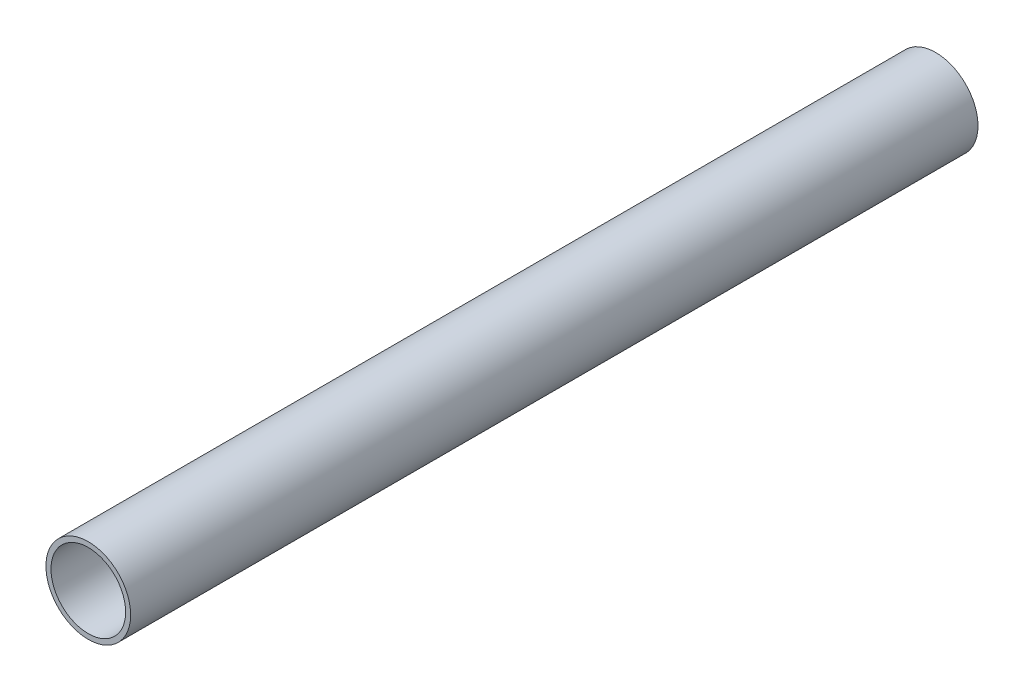
ISO-10303-21;
HEADER;
FILE_DESCRIPTION(('STEP AP214'),'2;1');
FILE_NAME('part.step','',(''),(''),'','','');
FILE_SCHEMA(('AUTOMOTIVE_DESIGN { 1 0 10303 214 1 1 1 1 }'));
ENDSEC;
DATA;
#1=APPLICATION_CONTEXT('core data for automotive mechanical design processes');
#2=APPLICATION_PROTOCOL_DEFINITION('international standard','automotive_design',2000,#1);
#3=PRODUCT_CONTEXT('',#1,'mechanical');
#4=PRODUCT('Part','Part','',(#3));
#5=PRODUCT_RELATED_PRODUCT_CATEGORY('part','',(#4));
#6=PRODUCT_DEFINITION_FORMATION('','',#4);
#7=PRODUCT_DEFINITION_CONTEXT('part definition',#1,'design');
#8=PRODUCT_DEFINITION('design','',#6,#7);
#9=PRODUCT_DEFINITION_SHAPE('','',#8);
#10=(LENGTH_UNIT() NAMED_UNIT(*) SI_UNIT(.MILLI.,.METRE.));
#11=(NAMED_UNIT(*) PLANE_ANGLE_UNIT() SI_UNIT($,.RADIAN.));
#12=(NAMED_UNIT(*) SI_UNIT($,.STERADIAN.) SOLID_ANGLE_UNIT());
#13=UNCERTAINTY_MEASURE_WITH_UNIT(LENGTH_MEASURE(1.E-05),#10,'distance_accuracy_value','');
#14=(GEOMETRIC_REPRESENTATION_CONTEXT(3) GLOBAL_UNCERTAINTY_ASSIGNED_CONTEXT((#13)) GLOBAL_UNIT_ASSIGNED_CONTEXT((#10,
#11,#12)) REPRESENTATION_CONTEXT('',''));
#15=CARTESIAN_POINT('',(0.,0.,0.));
#16=DIRECTION('',(0.,0.,1.));
#17=DIRECTION('',(1.,0.,0.));
#18=AXIS2_PLACEMENT_3D('',#15,#16,#17);
#19=CARTESIAN_POINT('',(0.,0.,320.));
#20=DIRECTION('',(0.,0.,1.));
#21=DIRECTION('',(1.,0.,0.));
#22=AXIS2_PLACEMENT_3D('',#19,#20,#21);
#23=PLANE('',#22);
#24=CARTESIAN_POINT('',(0.,0.,320.));
#25=DIRECTION('',(0.,0.,1.));
#26=DIRECTION('',(1.,0.,0.));
#27=AXIS2_PLACEMENT_3D('',#24,#25,#26);
#28=CIRCLE('',#27,16.);
#29=CARTESIAN_POINT('',(16.,0.,320.));
#30=VERTEX_POINT('',#29);
#31=EDGE_CURVE('E10',#30,#30,#28,.T.);
#32=ORIENTED_EDGE('',*,*,#31,.T.);
#33=EDGE_LOOP('',(#32));
#34=FACE_BOUND('',#33,.T.);
#35=CARTESIAN_POINT('',(0.,0.,320.));
#36=DIRECTION('',(0.,0.,1.));
#37=DIRECTION('',(1.,0.,0.));
#38=AXIS2_PLACEMENT_3D('',#35,#36,#37);
#39=CIRCLE('',#38,14.1);
#40=CARTESIAN_POINT('',(14.1,0.,320.));
#41=VERTEX_POINT('',#40);
#42=EDGE_CURVE('E41',#41,#41,#39,.T.);
#43=ORIENTED_EDGE('',*,*,#42,.F.);
#44=EDGE_LOOP('',(#43));
#45=FACE_BOUND('',#44,.T.);
#46=ADVANCED_FACE('F30',(#34,#45),#23,.T.);
#47=CARTESIAN_POINT('',(0.,0.,0.));
#48=DIRECTION('',(0.,0.,1.));
#49=DIRECTION('',(1.,0.,0.));
#50=AXIS2_PLACEMENT_3D('',#47,#48,#49);
#51=PLANE('',#50);
#52=CARTESIAN_POINT('',(0.,0.,0.));
#53=DIRECTION('',(0.,0.,1.));
#54=DIRECTION('',(1.,0.,0.));
#55=AXIS2_PLACEMENT_3D('',#52,#53,#54);
#56=CIRCLE('',#55,16.);
#57=CARTESIAN_POINT('',(16.,0.,0.));
#58=VERTEX_POINT('',#57);
#59=EDGE_CURVE('E34',#58,#58,#56,.T.);
#60=ORIENTED_EDGE('',*,*,#59,.F.);
#61=EDGE_LOOP('',(#60));
#62=FACE_BOUND('',#61,.T.);
#63=CARTESIAN_POINT('',(0.,0.,0.));
#64=DIRECTION('',(0.,0.,1.));
#65=DIRECTION('',(1.,0.,0.));
#66=AXIS2_PLACEMENT_3D('',#63,#64,#65);
#67=CIRCLE('',#66,14.1);
#68=CARTESIAN_POINT('',(14.1,0.,0.));
#69=VERTEX_POINT('',#68);
#70=EDGE_CURVE('E43',#69,#69,#67,.T.);
#71=ORIENTED_EDGE('',*,*,#70,.T.);
#72=EDGE_LOOP('',(#71));
#73=FACE_BOUND('',#72,.T.);
#74=ADVANCED_FACE('F53',(#62,#73),#51,.F.);
#75=CARTESIAN_POINT('',(0.,0.,320.));
#76=DIRECTION('',(0.,0.,-1.));
#77=DIRECTION('',(-1.,0.,0.));
#78=AXIS2_PLACEMENT_3D('',#75,#76,#77);
#79=CYLINDRICAL_SURFACE('',#78,16.);
#80=ORIENTED_EDGE('',*,*,#31,.F.);
#81=EDGE_LOOP('',(#80));
#82=FACE_BOUND('',#81,.T.);
#83=ORIENTED_EDGE('',*,*,#59,.T.);
#84=EDGE_LOOP('',(#83));
#85=FACE_BOUND('',#84,.T.);
#86=ADVANCED_FACE('F32',(#82,#85),#79,.T.);
#87=CARTESIAN_POINT('',(0.,0.,320.));
#88=DIRECTION('',(0.,0.,-1.));
#89=DIRECTION('',(-1.,0.,0.));
#90=AXIS2_PLACEMENT_3D('',#87,#88,#89);
#91=CYLINDRICAL_SURFACE('',#90,14.1);
#92=ORIENTED_EDGE('',*,*,#42,.T.);
#93=EDGE_LOOP('',(#92));
#94=FACE_BOUND('',#93,.T.);
#95=ORIENTED_EDGE('',*,*,#70,.F.);
#96=EDGE_LOOP('',(#95));
#97=FACE_BOUND('',#96,.T.);
#98=ADVANCED_FACE('F49',(#94,#97),#91,.F.);
#99=CLOSED_SHELL('',(#46,#74,#86,#98));
#100=MANIFOLD_SOLID_BREP('B2',#99);
#101=ADVANCED_BREP_SHAPE_REPRESENTATION('',(#18,#100),#14);
#102=SHAPE_DEFINITION_REPRESENTATION(#9,#101);
ENDSEC;
END-ISO-10303-21;
